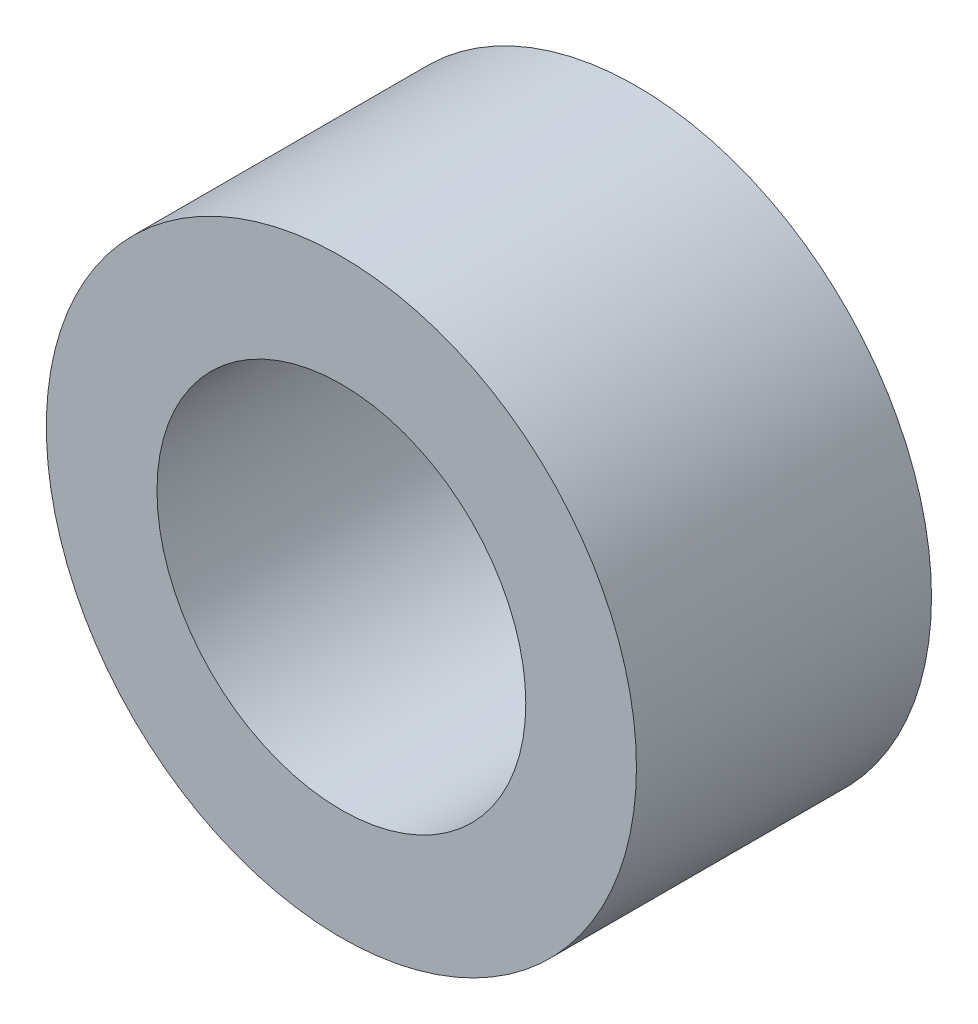
ISO-10303-21;
HEADER;
FILE_DESCRIPTION(('STEP AP214'),'2;1');
FILE_NAME('part.step','',(''),(''),'','','');
FILE_SCHEMA(('AUTOMOTIVE_DESIGN { 1 0 10303 214 1 1 1 1 }'));
ENDSEC;
DATA;
#1=APPLICATION_CONTEXT('core data for automotive mechanical design processes');
#2=APPLICATION_PROTOCOL_DEFINITION('international standard','automotive_design',2000,#1);
#3=PRODUCT_CONTEXT('',#1,'mechanical');
#4=PRODUCT('Part','Part','',(#3));
#5=PRODUCT_RELATED_PRODUCT_CATEGORY('part','',(#4));
#6=PRODUCT_DEFINITION_FORMATION('','',#4);
#7=PRODUCT_DEFINITION_CONTEXT('part definition',#1,'design');
#8=PRODUCT_DEFINITION('design','',#6,#7);
#9=PRODUCT_DEFINITION_SHAPE('','',#8);
#10=(LENGTH_UNIT() NAMED_UNIT(*) SI_UNIT(.MILLI.,.METRE.));
#11=(NAMED_UNIT(*) PLANE_ANGLE_UNIT() SI_UNIT($,.RADIAN.));
#12=(NAMED_UNIT(*) SI_UNIT($,.STERADIAN.) SOLID_ANGLE_UNIT());
#13=UNCERTAINTY_MEASURE_WITH_UNIT(LENGTH_MEASURE(1.E-05),#10,'distance_accuracy_value','');
#14=(GEOMETRIC_REPRESENTATION_CONTEXT(3) GLOBAL_UNCERTAINTY_ASSIGNED_CONTEXT((#13)) GLOBAL_UNIT_ASSIGNED_CONTEXT((#10,
#11,#12)) REPRESENTATION_CONTEXT('',''));
#15=CARTESIAN_POINT('',(0.,0.,0.));
#16=DIRECTION('',(0.,0.,1.));
#17=DIRECTION('',(1.,0.,0.));
#18=AXIS2_PLACEMENT_3D('',#15,#16,#17);
#19=CARTESIAN_POINT('',(0.,0.,5.));
#20=DIRECTION('',(0.,0.,1.));
#21=DIRECTION('',(1.,0.,0.));
#22=AXIS2_PLACEMENT_3D('',#19,#20,#21);
#23=PLANE('',#22);
#24=CARTESIAN_POINT('',(0.,0.,5.));
#25=DIRECTION('',(0.,0.,1.));
#26=DIRECTION('',(1.,0.,0.));
#27=AXIS2_PLACEMENT_3D('',#24,#25,#26);
#28=CIRCLE('',#27,5.);
#29=CARTESIAN_POINT('',(5.,0.,5.));
#30=VERTEX_POINT('',#29);
#31=EDGE_CURVE('E10',#30,#30,#28,.T.);
#32=ORIENTED_EDGE('',*,*,#31,.T.);
#33=EDGE_LOOP('',(#32));
#34=FACE_BOUND('',#33,.T.);
#35=CARTESIAN_POINT('',(0.,0.,5.));
#36=DIRECTION('',(0.,0.,1.));
#37=DIRECTION('',(1.,0.,0.));
#38=AXIS2_PLACEMENT_3D('',#35,#36,#37);
#39=CIRCLE('',#38,3.125);
#40=CARTESIAN_POINT('',(3.125,0.,5.));
#41=VERTEX_POINT('',#40);
#42=EDGE_CURVE('E56',#41,#41,#39,.T.);
#43=ORIENTED_EDGE('',*,*,#42,.F.);
#44=EDGE_LOOP('',(#43));
#45=FACE_BOUND('',#44,.T.);
#46=ADVANCED_FACE('F43',(#34,#45),#23,.T.);
#47=CARTESIAN_POINT('',(0.,0.,0.));
#48=DIRECTION('',(0.,0.,1.));
#49=DIRECTION('',(1.,0.,0.));
#50=AXIS2_PLACEMENT_3D('',#47,#48,#49);
#51=PLANE('',#50);
#52=CARTESIAN_POINT('',(0.,0.,0.));
#53=DIRECTION('',(0.,0.,1.));
#54=DIRECTION('',(1.,0.,0.));
#55=AXIS2_PLACEMENT_3D('',#52,#53,#54);
#56=CIRCLE('',#55,5.);
#57=CARTESIAN_POINT('',(5.,0.,0.));
#58=VERTEX_POINT('',#57);
#59=EDGE_CURVE('E47',#58,#58,#56,.T.);
#60=ORIENTED_EDGE('',*,*,#59,.F.);
#61=EDGE_LOOP('',(#60));
#62=FACE_BOUND('',#61,.T.);
#63=CARTESIAN_POINT('',(0.,0.,0.));
#64=DIRECTION('',(0.,0.,1.));
#65=DIRECTION('',(1.,0.,0.));
#66=AXIS2_PLACEMENT_3D('',#63,#64,#65);
#67=CIRCLE('',#66,3.125);
#68=CARTESIAN_POINT('',(3.125,0.,0.));
#69=VERTEX_POINT('',#68);
#70=EDGE_CURVE('E58',#69,#69,#67,.T.);
#71=ORIENTED_EDGE('',*,*,#70,.T.);
#72=EDGE_LOOP('',(#71));
#73=FACE_BOUND('',#72,.T.);
#74=ADVANCED_FACE('F70',(#62,#73),#51,.F.);
#75=CARTESIAN_POINT('',(0.,0.,5.));
#76=DIRECTION('',(0.,0.,-1.));
#77=DIRECTION('',(-1.,0.,0.));
#78=AXIS2_PLACEMENT_3D('',#75,#76,#77);
#79=CYLINDRICAL_SURFACE('',#78,5.);
#80=ORIENTED_EDGE('',*,*,#31,.F.);
#81=EDGE_LOOP('',(#80));
#82=FACE_BOUND('',#81,.T.);
#83=ORIENTED_EDGE('',*,*,#59,.T.);
#84=EDGE_LOOP('',(#83));
#85=FACE_BOUND('',#84,.T.);
#86=ADVANCED_FACE('F45',(#82,#85),#79,.T.);
#87=CARTESIAN_POINT('',(0.,0.,5.));
#88=DIRECTION('',(0.,0.,-1.));
#89=DIRECTION('',(-1.,0.,0.));
#90=AXIS2_PLACEMENT_3D('',#87,#88,#89);
#91=CYLINDRICAL_SURFACE('',#90,3.125);
#92=ORIENTED_EDGE('',*,*,#42,.T.);
#93=EDGE_LOOP('',(#92));
#94=FACE_BOUND('',#93,.T.);
#95=ORIENTED_EDGE('',*,*,#70,.F.);
#96=EDGE_LOOP('',(#95));
#97=FACE_BOUND('',#96,.T.);
#98=ADVANCED_FACE('F66',(#94,#97),#91,.F.);
#99=CLOSED_SHELL('',(#46,#74,#86,#98));
#100=MANIFOLD_SOLID_BREP('B2',#99);
#101=ADVANCED_BREP_SHAPE_REPRESENTATION('',(#18,#100),#14);
#102=SHAPE_DEFINITION_REPRESENTATION(#9,#101);
ENDSEC;
END-ISO-10303-21;
